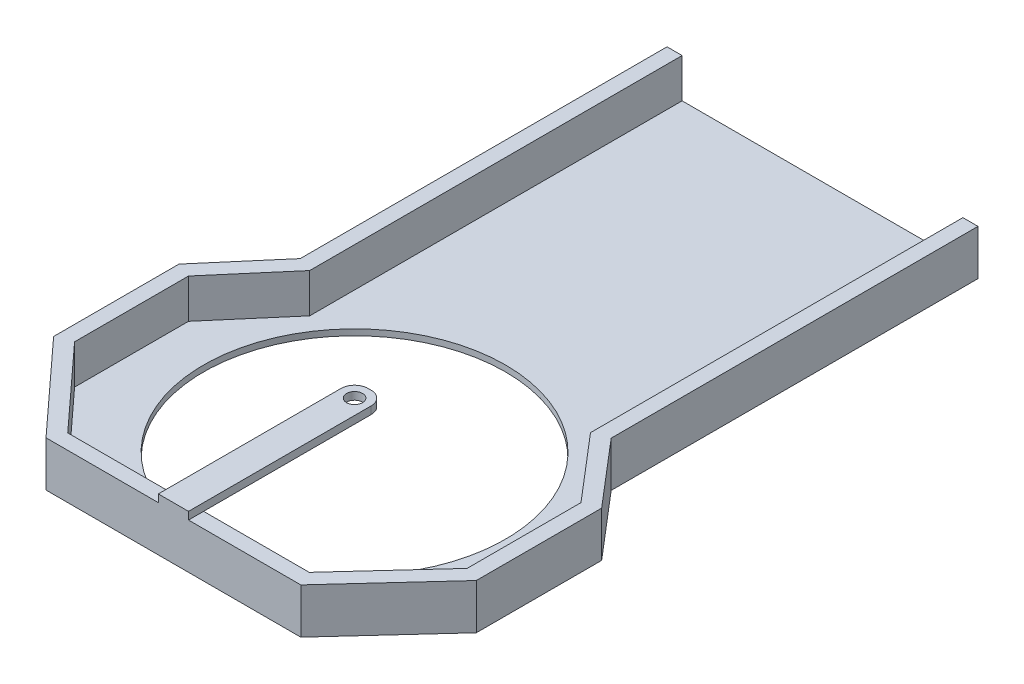
ISO-10303-21;
HEADER;
FILE_DESCRIPTION(('STEP AP214'),'2;1');
FILE_NAME('part.step','',(''),(''),'','','');
FILE_SCHEMA(('AUTOMOTIVE_DESIGN { 1 0 10303 214 1 1 1 1 }'));
ENDSEC;
DATA;
#1=APPLICATION_CONTEXT('core data for automotive mechanical design processes');
#2=APPLICATION_PROTOCOL_DEFINITION('international standard','automotive_design',2000,#1);
#3=PRODUCT_CONTEXT('',#1,'mechanical');
#4=PRODUCT('Part','Part','',(#3));
#5=PRODUCT_RELATED_PRODUCT_CATEGORY('part','',(#4));
#6=PRODUCT_DEFINITION_FORMATION('','',#4);
#7=PRODUCT_DEFINITION_CONTEXT('part definition',#1,'design');
#8=PRODUCT_DEFINITION('design','',#6,#7);
#9=PRODUCT_DEFINITION_SHAPE('','',#8);
#10=(LENGTH_UNIT() NAMED_UNIT(*) SI_UNIT(.MILLI.,.METRE.));
#11=(NAMED_UNIT(*) PLANE_ANGLE_UNIT() SI_UNIT($,.RADIAN.));
#12=(NAMED_UNIT(*) SI_UNIT($,.STERADIAN.) SOLID_ANGLE_UNIT());
#13=UNCERTAINTY_MEASURE_WITH_UNIT(LENGTH_MEASURE(1.E-05),#10,'distance_accuracy_value','');
#14=(GEOMETRIC_REPRESENTATION_CONTEXT(3) GLOBAL_UNCERTAINTY_ASSIGNED_CONTEXT((#13)) GLOBAL_UNIT_ASSIGNED_CONTEXT((#10,
#11,#12)) REPRESENTATION_CONTEXT('',''));
#15=CARTESIAN_POINT('',(0.,0.,0.));
#16=DIRECTION('',(0.,0.,1.));
#17=DIRECTION('',(1.,0.,0.));
#18=AXIS2_PLACEMENT_3D('',#15,#16,#17);
#19=CARTESIAN_POINT('',(0.,15.,0.));
#20=DIRECTION('',(0.,1.,0.));
#21=DIRECTION('',(0.,0.,1.));
#22=AXIS2_PLACEMENT_3D('',#19,#20,#21);
#23=PLANE('',#22);
#24=DIRECTION('',(1.,0.,0.));
#25=VECTOR('',#24,1.);
#26=CARTESIAN_POINT('',(-40.,15.,65.));
#27=LINE('',#26,#25);
#28=CARTESIAN_POINT('',(5.,15.,65.));
#29=VERTEX_POINT('',#28);
#30=CARTESIAN_POINT('',(40.,15.,65.));
#31=VERTEX_POINT('',#30);
#32=EDGE_CURVE('E114',#29,#31,#27,.T.);
#33=ORIENTED_EDGE('',*,*,#32,.F.);
#34=DIRECTION('',(0.,0.,1.));
#35=VECTOR('',#34,1.);
#36=CARTESIAN_POINT('',(5.,15.,9.50000000000001));
#37=LINE('',#36,#35);
#38=CARTESIAN_POINT('',(5.,15.,70.));
#39=VERTEX_POINT('',#38);
#40=EDGE_CURVE('E12',#29,#39,#37,.T.);
#41=ORIENTED_EDGE('',*,*,#40,.T.);
#42=DIRECTION('',(1.,0.,0.));
#43=VECTOR('',#42,1.);
#44=CARTESIAN_POINT('',(-40.,15.,70.));
#45=LINE('',#44,#43);
#46=CARTESIAN_POINT('',(42.1992175446281,15.,70.));
#47=VERTEX_POINT('',#46);
#48=EDGE_CURVE('E370',#39,#47,#45,.T.);
#49=ORIENTED_EDGE('',*,*,#48,.T.);
#50=DIRECTION('',(0.67579652856565,0.,-0.737088225369675));
#51=VECTOR('',#50,1.);
#52=CARTESIAN_POINT('',(43.6854411268484,15.,68.3789826428282));
#53=LINE('',#52,#51);
#54=CARTESIAN_POINT('',(70.,15.,39.6778119777988));
#55=VERTEX_POINT('',#54);
#56=EDGE_CURVE('E374',#47,#55,#53,.T.);
#57=ORIENTED_EDGE('',*,*,#56,.T.);
#58=DIRECTION('',(0.,0.,-1.));
#59=VECTOR('',#58,1.);
#60=CARTESIAN_POINT('',(70.,15.,0.));
#61=LINE('',#60,#59);
#62=CARTESIAN_POINT('',(70.,15.,-1.84503280254698));
#63=VERTEX_POINT('',#62);
#64=EDGE_CURVE('E376',#55,#63,#61,.T.);
#65=ORIENTED_EDGE('',*,*,#64,.T.);
#66=DIRECTION('',(-0.649564609260897,0.,-0.760306397708015));
#67=VECTOR('',#66,1.);
#68=CARTESIAN_POINT('',(68.8015319885401,15.,-3.24782304630455));
#69=LINE('',#68,#67);
#70=CARTESIAN_POINT('',(51.5,15.,-23.4990271197602));
#71=VERTEX_POINT('',#70);
#72=EDGE_CURVE('E378',#63,#71,#69,.T.);
#73=ORIENTED_EDGE('',*,*,#72,.T.);
#74=DIRECTION('',(0.,0.,-1.));
#75=VECTOR('',#74,1.);
#76=CARTESIAN_POINT('',(51.5,15.,-21.6539943172133));
#77=LINE('',#76,#75);
#78=CARTESIAN_POINT('',(51.5,15.,-145.));
#79=VERTEX_POINT('',#78);
#80=EDGE_CURVE('E380',#71,#79,#77,.T.);
#81=ORIENTED_EDGE('',*,*,#80,.T.);
#82=DIRECTION('',(-1.,0.,0.));
#83=VECTOR('',#82,1.);
#84=CARTESIAN_POINT('',(-46.5,15.,-145.));
#85=LINE('',#84,#83);
#86=CARTESIAN_POINT('',(46.5,15.,-145.));
#87=VERTEX_POINT('',#86);
#88=EDGE_CURVE('E383',#79,#87,#85,.T.);
#89=ORIENTED_EDGE('',*,*,#88,.T.);
#90=DIRECTION('',(0.,0.,-1.));
#91=VECTOR('',#90,1.);
#92=CARTESIAN_POINT('',(46.5,15.,-21.6539943172133));
#93=LINE('',#92,#91);
#94=CARTESIAN_POINT('',(46.5,15.,-21.6539943172133));
#95=VERTEX_POINT('',#94);
#96=EDGE_CURVE('E334',#95,#87,#93,.T.);
#97=ORIENTED_EDGE('',*,*,#96,.F.);
#98=DIRECTION('',(-0.649564609260897,0.,-0.760306397708015));
#99=VECTOR('',#98,1.);
#100=CARTESIAN_POINT('',(65.,15.,0.));
#101=LINE('',#100,#99);
#102=CARTESIAN_POINT('',(65.,15.,0.));
#103=VERTEX_POINT('',#102);
#104=EDGE_CURVE('E332',#103,#95,#101,.T.);
#105=ORIENTED_EDGE('',*,*,#104,.F.);
#106=DIRECTION('',(0.,0.,-1.));
#107=VECTOR('',#106,1.);
#108=CARTESIAN_POINT('',(65.,15.,0.));
#109=LINE('',#108,#107);
#110=CARTESIAN_POINT('',(65.,15.,37.7326127682946));
#111=VERTEX_POINT('',#110);
#112=EDGE_CURVE('E330',#111,#103,#109,.T.);
#113=ORIENTED_EDGE('',*,*,#112,.F.);
#114=DIRECTION('',(0.67579652856565,0.,-0.737088225369675));
#115=VECTOR('',#114,1.);
#116=CARTESIAN_POINT('',(40.,15.,65.));
#117=LINE('',#116,#115);
#118=EDGE_CURVE('E327',#31,#111,#117,.T.);
#119=ORIENTED_EDGE('',*,*,#118,.F.);
#120=EDGE_LOOP('',(#33,#41,#49,#57,#65,#73,#81,#89,#97,#105,#113,#119));
#121=FACE_BOUND('',#120,.T.);
#122=ADVANCED_FACE('F97',(#121),#23,.T.);
#123=CARTESIAN_POINT('',(0.,2.,0.));
#124=DIRECTION('',(0.,-1.,0.));
#125=DIRECTION('',(0.,0.,-1.));
#126=AXIS2_PLACEMENT_3D('',#123,#124,#125);
#127=PLANE('',#126);
#128=CARTESIAN_POINT('',(0.,2.,10.));
#129=DIRECTION('',(0.,1.,0.));
#130=DIRECTION('',(0.,0.,1.));
#131=AXIS2_PLACEMENT_3D('',#128,#129,#130);
#132=CIRCLE('',#131,50.);
#133=CARTESIAN_POINT('',(0.,2.,60.));
#134=VERTEX_POINT('',#133);
#135=EDGE_CURVE('E303',#134,#134,#132,.T.);
#136=ORIENTED_EDGE('',*,*,#135,.F.);
#137=EDGE_LOOP('',(#136));
#138=FACE_BOUND('',#137,.T.);
#139=DIRECTION('',(0.649564609260895,0.,-0.760306397708016));
#140=VECTOR('',#139,1.);
#141=CARTESIAN_POINT('',(-65.,2.,0.));
#142=LINE('',#141,#140);
#143=CARTESIAN_POINT('',(-65.,2.,0.));
#144=VERTEX_POINT('',#143);
#145=CARTESIAN_POINT('',(-46.5,2.,-21.6539943172133));
#146=VERTEX_POINT('',#145);
#147=EDGE_CURVE('E441',#144,#146,#142,.T.);
#148=ORIENTED_EDGE('',*,*,#147,.F.);
#149=DIRECTION('',(0.,0.,1.));
#150=VECTOR('',#149,1.);
#151=CARTESIAN_POINT('',(-65.,2.,0.));
#152=LINE('',#151,#150);
#153=CARTESIAN_POINT('',(-65.,2.,37.7326127682946));
#154=VERTEX_POINT('',#153);
#155=EDGE_CURVE('E101',#144,#154,#152,.T.);
#156=ORIENTED_EDGE('',*,*,#155,.T.);
#157=DIRECTION('',(0.675796528565651,0.,0.737088225369675));
#158=VECTOR('',#157,1.);
#159=CARTESIAN_POINT('',(-65.,2.,37.7326127682946));
#160=LINE('',#159,#158);
#161=CARTESIAN_POINT('',(-40.,2.,65.));
#162=VERTEX_POINT('',#161);
#163=EDGE_CURVE('E457',#154,#162,#160,.T.);
#164=ORIENTED_EDGE('',*,*,#163,.T.);
#165=DIRECTION('',(1.,0.,0.));
#166=VECTOR('',#165,1.);
#167=CARTESIAN_POINT('',(-40.,2.,65.));
#168=LINE('',#167,#166);
#169=CARTESIAN_POINT('',(40.,2.,65.));
#170=VERTEX_POINT('',#169);
#171=EDGE_CURVE('E455',#162,#170,#168,.T.);
#172=ORIENTED_EDGE('',*,*,#171,.T.);
#173=DIRECTION('',(0.67579652856565,0.,-0.737088225369675));
#174=VECTOR('',#173,1.);
#175=CARTESIAN_POINT('',(40.,2.,65.));
#176=LINE('',#175,#174);
#177=CARTESIAN_POINT('',(65.,2.,37.7326127682946));
#178=VERTEX_POINT('',#177);
#179=EDGE_CURVE('E452',#170,#178,#176,.T.);
#180=ORIENTED_EDGE('',*,*,#179,.T.);
#181=DIRECTION('',(0.,0.,1.));
#182=VECTOR('',#181,1.);
#183=CARTESIAN_POINT('',(65.,2.,0.));
#184=LINE('',#183,#182);
#185=CARTESIAN_POINT('',(65.,2.,0.));
#186=VERTEX_POINT('',#185);
#187=EDGE_CURVE('E450',#186,#178,#184,.T.);
#188=ORIENTED_EDGE('',*,*,#187,.F.);
#189=DIRECTION('',(-0.649564609260897,0.,-0.760306397708015));
#190=VECTOR('',#189,1.);
#191=CARTESIAN_POINT('',(65.,2.,0.));
#192=LINE('',#191,#190);
#193=CARTESIAN_POINT('',(46.5,2.,-21.6539943172133));
#194=VERTEX_POINT('',#193);
#195=EDGE_CURVE('E447',#186,#194,#192,.T.);
#196=ORIENTED_EDGE('',*,*,#195,.T.);
#197=DIRECTION('',(0.,0.,-1.));
#198=VECTOR('',#197,1.);
#199=CARTESIAN_POINT('',(46.5,2.,-21.6539943172133));
#200=LINE('',#199,#198);
#201=CARTESIAN_POINT('',(46.5,2.,-145.));
#202=VERTEX_POINT('',#201);
#203=EDGE_CURVE('E445',#194,#202,#200,.T.);
#204=ORIENTED_EDGE('',*,*,#203,.T.);
#205=DIRECTION('',(-1.,0.,0.));
#206=VECTOR('',#205,1.);
#207=CARTESIAN_POINT('',(-46.5,2.,-145.));
#208=LINE('',#207,#206);
#209=CARTESIAN_POINT('',(-46.5,2.,-145.));
#210=VERTEX_POINT('',#209);
#211=EDGE_CURVE('E320',#202,#210,#208,.T.);
#212=ORIENTED_EDGE('',*,*,#211,.T.);
#213=DIRECTION('',(0.,0.,-1.));
#214=VECTOR('',#213,1.);
#215=CARTESIAN_POINT('',(-46.5,2.,-21.6539943172133));
#216=LINE('',#215,#214);
#217=EDGE_CURVE('E443',#146,#210,#216,.T.);
#218=ORIENTED_EDGE('',*,*,#217,.F.);
#219=EDGE_LOOP('',(#148,#156,#164,#172,#180,#188,#196,#204,#212,#218));
#220=FACE_BOUND('',#219,.T.);
#221=ADVANCED_FACE('F505',(#138,#220),#127,.F.);
#222=CARTESIAN_POINT('',(-65.,15.,37.7326127682946));
#223=DIRECTION('',(0.737088225369674,0.,-0.67579652856565));
#224=DIRECTION('',(-0.675796528565651,0.,-0.737088225369675));
#225=AXIS2_PLACEMENT_3D('',#222,#223,#224);
#226=PLANE('',#225);
#227=ORIENTED_EDGE('',*,*,#163,.F.);
#228=DIRECTION('',(0.,-1.,0.));
#229=VECTOR('',#228,1.);
#230=CARTESIAN_POINT('',(-65.,15.,37.7326127682946));
#231=LINE('',#230,#229);
#232=CARTESIAN_POINT('',(-65.,15.,37.7326127682946));
#233=VERTEX_POINT('',#232);
#234=EDGE_CURVE('E343',#233,#154,#231,.T.);
#235=ORIENTED_EDGE('',*,*,#234,.F.);
#236=DIRECTION('',(0.675796528565651,0.,0.737088225369675));
#237=VECTOR('',#236,1.);
#238=CARTESIAN_POINT('',(-65.,15.,37.7326127682946));
#239=LINE('',#238,#237);
#240=CARTESIAN_POINT('',(-40.,15.,65.));
#241=VERTEX_POINT('',#240);
#242=EDGE_CURVE('E323',#233,#241,#239,.T.);
#243=ORIENTED_EDGE('',*,*,#242,.T.);
#244=DIRECTION('',(0.,-1.,0.));
#245=VECTOR('',#244,1.);
#246=CARTESIAN_POINT('',(-40.,15.,65.));
#247=LINE('',#246,#245);
#248=EDGE_CURVE('E363',#241,#162,#247,.T.);
#249=ORIENTED_EDGE('',*,*,#248,.T.);
#250=EDGE_LOOP('',(#227,#235,#243,#249));
#251=FACE_BOUND('',#250,.T.);
#252=ADVANCED_FACE('F511',(#251),#226,.T.);
#253=CARTESIAN_POINT('',(-40.,15.,65.));
#254=DIRECTION('',(0.,0.,-1.));
#255=DIRECTION('',(-1.,0.,0.));
#256=AXIS2_PLACEMENT_3D('',#253,#254,#255);
#257=PLANE('',#256);
#258=ORIENTED_EDGE('',*,*,#171,.F.);
#259=ORIENTED_EDGE('',*,*,#248,.F.);
#260=CARTESIAN_POINT('',(-5.,15.,65.));
#261=VERTEX_POINT('',#260);
#262=EDGE_CURVE('E325',#241,#261,#27,.T.);
#263=ORIENTED_EDGE('',*,*,#262,.T.);
#264=EDGE_CURVE('E328',#261,#29,#27,.T.);
#265=ORIENTED_EDGE('',*,*,#264,.T.);
#266=ORIENTED_EDGE('',*,*,#32,.T.);
#267=DIRECTION('',(0.,-1.,0.));
#268=VECTOR('',#267,1.);
#269=CARTESIAN_POINT('',(40.,15.,65.));
#270=LINE('',#269,#268);
#271=EDGE_CURVE('E360',#31,#170,#270,.T.);
#272=ORIENTED_EDGE('',*,*,#271,.T.);
#273=EDGE_LOOP('',(#258,#259,#263,#265,#266,#272));
#274=FACE_BOUND('',#273,.T.);
#275=ADVANCED_FACE('F556',(#274),#257,.T.);
#276=CARTESIAN_POINT('',(40.,15.,65.));
#277=DIRECTION('',(-0.737088225369675,0.,-0.67579652856565));
#278=DIRECTION('',(-0.67579652856565,0.,0.737088225369675));
#279=AXIS2_PLACEMENT_3D('',#276,#277,#278);
#280=PLANE('',#279);
#281=ORIENTED_EDGE('',*,*,#179,.F.);
#282=ORIENTED_EDGE('',*,*,#271,.F.);
#283=ORIENTED_EDGE('',*,*,#118,.T.);
#284=DIRECTION('',(0.,-1.,0.));
#285=VECTOR('',#284,1.);
#286=CARTESIAN_POINT('',(65.,15.,37.7326127682946));
#287=LINE('',#286,#285);
#288=EDGE_CURVE('E357',#111,#178,#287,.T.);
#289=ORIENTED_EDGE('',*,*,#288,.T.);
#290=EDGE_LOOP('',(#281,#282,#283,#289));
#291=FACE_BOUND('',#290,.T.);
#292=ADVANCED_FACE('F552',(#291),#280,.T.);
#293=CARTESIAN_POINT('',(65.,15.,0.));
#294=DIRECTION('',(-1.,0.,0.));
#295=DIRECTION('',(0.,0.,1.));
#296=AXIS2_PLACEMENT_3D('',#293,#294,#295);
#297=PLANE('',#296);
#298=ORIENTED_EDGE('',*,*,#187,.T.);
#299=ORIENTED_EDGE('',*,*,#288,.F.);
#300=ORIENTED_EDGE('',*,*,#112,.T.);
#301=DIRECTION('',(0.,-1.,0.));
#302=VECTOR('',#301,1.);
#303=CARTESIAN_POINT('',(65.,15.,0.));
#304=LINE('',#303,#302);
#305=EDGE_CURVE('E354',#103,#186,#304,.T.);
#306=ORIENTED_EDGE('',*,*,#305,.T.);
#307=EDGE_LOOP('',(#298,#299,#300,#306));
#308=FACE_BOUND('',#307,.T.);
#309=ADVANCED_FACE('F548',(#308),#297,.T.);
#310=CARTESIAN_POINT('',(65.,15.,0.));
#311=DIRECTION('',(-0.760306397708015,0.,0.649564609260897));
#312=DIRECTION('',(0.649564609260897,0.,0.760306397708015));
#313=AXIS2_PLACEMENT_3D('',#310,#311,#312);
#314=PLANE('',#313);
#315=ORIENTED_EDGE('',*,*,#195,.F.);
#316=ORIENTED_EDGE('',*,*,#305,.F.);
#317=ORIENTED_EDGE('',*,*,#104,.T.);
#318=DIRECTION('',(0.,-1.,0.));
#319=VECTOR('',#318,1.);
#320=CARTESIAN_POINT('',(46.5,15.,-21.6539943172133));
#321=LINE('',#320,#319);
#322=EDGE_CURVE('E351',#95,#194,#321,.T.);
#323=ORIENTED_EDGE('',*,*,#322,.T.);
#324=EDGE_LOOP('',(#315,#316,#317,#323));
#325=FACE_BOUND('',#324,.T.);
#326=ADVANCED_FACE('F544',(#325),#314,.T.);
#327=CARTESIAN_POINT('',(46.5,15.,-21.6539943172133));
#328=DIRECTION('',(-1.,0.,0.));
#329=DIRECTION('',(0.,0.,1.));
#330=AXIS2_PLACEMENT_3D('',#327,#328,#329);
#331=PLANE('',#330);
#332=ORIENTED_EDGE('',*,*,#203,.F.);
#333=ORIENTED_EDGE('',*,*,#322,.F.);
#334=ORIENTED_EDGE('',*,*,#96,.T.);
#335=DIRECTION('',(0.,-1.,0.));
#336=VECTOR('',#335,1.);
#337=CARTESIAN_POINT('',(46.5,15.,-145.));
#338=LINE('',#337,#336);
#339=EDGE_CURVE('E314',#87,#202,#338,.T.);
#340=ORIENTED_EDGE('',*,*,#339,.T.);
#341=EDGE_LOOP('',(#332,#333,#334,#340));
#342=FACE_BOUND('',#341,.T.);
#343=ADVANCED_FACE('F540',(#342),#331,.T.);
#344=CARTESIAN_POINT('',(-46.5,15.,-21.6539943172133));
#345=DIRECTION('',(1.,0.,0.));
#346=DIRECTION('',(0.,0.,-1.));
#347=AXIS2_PLACEMENT_3D('',#344,#345,#346);
#348=PLANE('',#347);
#349=ORIENTED_EDGE('',*,*,#217,.T.);
#350=DIRECTION('',(0.,1.,0.));
#351=VECTOR('',#350,1.);
#352=CARTESIAN_POINT('',(-46.5,15.,-145.));
#353=LINE('',#352,#351);
#354=CARTESIAN_POINT('',(-46.5,15.,-145.));
#355=VERTEX_POINT('',#354);
#356=EDGE_CURVE('E317',#210,#355,#353,.T.);
#357=ORIENTED_EDGE('',*,*,#356,.T.);
#358=DIRECTION('',(0.,0.,1.));
#359=VECTOR('',#358,1.);
#360=CARTESIAN_POINT('',(-46.5,15.,-21.6539943172133));
#361=LINE('',#360,#359);
#362=CARTESIAN_POINT('',(-46.5,15.,-21.6539943172133));
#363=VERTEX_POINT('',#362);
#364=EDGE_CURVE('E336',#355,#363,#361,.T.);
#365=ORIENTED_EDGE('',*,*,#364,.T.);
#366=DIRECTION('',(0.,-1.,0.));
#367=VECTOR('',#366,1.);
#368=CARTESIAN_POINT('',(-46.5,15.,-21.6539943172133));
#369=LINE('',#368,#367);
#370=EDGE_CURVE('E348',#363,#146,#369,.T.);
#371=ORIENTED_EDGE('',*,*,#370,.T.);
#372=EDGE_LOOP('',(#349,#357,#365,#371));
#373=FACE_BOUND('',#372,.T.);
#374=ADVANCED_FACE('F531',(#373),#348,.T.);
#375=CARTESIAN_POINT('',(-65.,15.,0.));
#376=DIRECTION('',(0.760306397708016,0.,0.649564609260895));
#377=DIRECTION('',(0.649564609260895,0.,-0.760306397708016));
#378=AXIS2_PLACEMENT_3D('',#375,#376,#377);
#379=PLANE('',#378);
#380=ORIENTED_EDGE('',*,*,#147,.T.);
#381=ORIENTED_EDGE('',*,*,#370,.F.);
#382=DIRECTION('',(-0.649564609260895,0.,0.760306397708016));
#383=VECTOR('',#382,1.);
#384=CARTESIAN_POINT('',(-65.,15.,0.));
#385=LINE('',#384,#383);
#386=CARTESIAN_POINT('',(-65.,15.,0.));
#387=VERTEX_POINT('',#386);
#388=EDGE_CURVE('E338',#363,#387,#385,.T.);
#389=ORIENTED_EDGE('',*,*,#388,.T.);
#390=DIRECTION('',(0.,-1.,0.));
#391=VECTOR('',#390,1.);
#392=CARTESIAN_POINT('',(-65.,15.,0.));
#393=LINE('',#392,#391);
#394=EDGE_CURVE('E345',#387,#144,#393,.T.);
#395=ORIENTED_EDGE('',*,*,#394,.T.);
#396=EDGE_LOOP('',(#380,#381,#389,#395));
#397=FACE_BOUND('',#396,.T.);
#398=ADVANCED_FACE('F525',(#397),#379,.T.);
#399=CARTESIAN_POINT('',(-65.,15.,0.));
#400=DIRECTION('',(1.,0.,0.));
#401=DIRECTION('',(0.,0.,-1.));
#402=AXIS2_PLACEMENT_3D('',#399,#400,#401);
#403=PLANE('',#402);
#404=ORIENTED_EDGE('',*,*,#155,.F.);
#405=ORIENTED_EDGE('',*,*,#394,.F.);
#406=DIRECTION('',(0.,0.,1.));
#407=VECTOR('',#406,1.);
#408=CARTESIAN_POINT('',(-65.,15.,0.));
#409=LINE('',#408,#407);
#410=EDGE_CURVE('E341',#387,#233,#409,.T.);
#411=ORIENTED_EDGE('',*,*,#410,.T.);
#412=ORIENTED_EDGE('',*,*,#234,.T.);
#413=EDGE_LOOP('',(#404,#405,#411,#412));
#414=FACE_BOUND('',#413,.T.);
#415=ADVANCED_FACE('F517',(#414),#403,.T.);
#416=DIRECTION('',(0.,0.,1.));
#417=VECTOR('',#416,1.);
#418=CARTESIAN_POINT('',(-5.,15.,9.50000000000001));
#419=LINE('',#418,#417);
#420=CARTESIAN_POINT('',(-4.99999999999999,15.,70.));
#421=VERTEX_POINT('',#420);
#422=EDGE_CURVE('E106',#261,#421,#419,.T.);
#423=ORIENTED_EDGE('',*,*,#422,.F.);
#424=ORIENTED_EDGE('',*,*,#262,.F.);
#425=ORIENTED_EDGE('',*,*,#242,.F.);
#426=ORIENTED_EDGE('',*,*,#410,.F.);
#427=ORIENTED_EDGE('',*,*,#388,.F.);
#428=ORIENTED_EDGE('',*,*,#364,.F.);
#429=CARTESIAN_POINT('',(-51.5,15.,-145.));
#430=VERTEX_POINT('',#429);
#431=EDGE_CURVE('E382',#355,#430,#85,.T.);
#432=ORIENTED_EDGE('',*,*,#431,.T.);
#433=DIRECTION('',(0.,0.,1.));
#434=VECTOR('',#433,1.);
#435=CARTESIAN_POINT('',(-51.5,15.,-21.6539943172133));
#436=LINE('',#435,#434);
#437=CARTESIAN_POINT('',(-51.5,15.,-23.4990271197602));
#438=VERTEX_POINT('',#437);
#439=EDGE_CURVE('E386',#430,#438,#436,.T.);
#440=ORIENTED_EDGE('',*,*,#439,.T.);
#441=DIRECTION('',(-0.649564609260895,0.,0.760306397708016));
#442=VECTOR('',#441,1.);
#443=CARTESIAN_POINT('',(-68.8015319885401,15.,-3.24782304630445));
#444=LINE('',#443,#442);
#445=CARTESIAN_POINT('',(-70.,15.,-1.84503280254688));
#446=VERTEX_POINT('',#445);
#447=EDGE_CURVE('E388',#438,#446,#444,.T.);
#448=ORIENTED_EDGE('',*,*,#447,.T.);
#449=DIRECTION('',(0.,0.,1.));
#450=VECTOR('',#449,1.);
#451=CARTESIAN_POINT('',(-70.,15.,0.));
#452=LINE('',#451,#450);
#453=CARTESIAN_POINT('',(-70.,15.,39.6778119777988));
#454=VERTEX_POINT('',#453);
#455=EDGE_CURVE('E390',#446,#454,#452,.T.);
#456=ORIENTED_EDGE('',*,*,#455,.T.);
#457=DIRECTION('',(0.67579652856565,0.,0.737088225369674));
#458=VECTOR('',#457,1.);
#459=CARTESIAN_POINT('',(-68.6854411268484,15.,41.1115954111228));
#460=LINE('',#459,#458);
#461=CARTESIAN_POINT('',(-42.1992175446281,15.,70.));
#462=VERTEX_POINT('',#461);
#463=EDGE_CURVE('E367',#454,#462,#460,.T.);
#464=ORIENTED_EDGE('',*,*,#463,.T.);
#465=EDGE_CURVE('E372',#462,#421,#45,.T.);
#466=ORIENTED_EDGE('',*,*,#465,.T.);
#467=EDGE_LOOP('',(#423,#424,#425,#426,#427,#428,#432,#440,#448,#456,#464,#466));
#468=FACE_BOUND('',#467,.T.);
#469=ADVANCED_FACE('F507',(#468),#23,.T.);
#470=CARTESIAN_POINT('',(-68.6854411268484,15.,41.1115954111228));
#471=DIRECTION('',(0.737088225369674,0.,-0.67579652856565));
#472=DIRECTION('',(-0.675796528565651,0.,-0.737088225369675));
#473=AXIS2_PLACEMENT_3D('',#470,#471,#472);
#474=PLANE('',#473);
#475=DIRECTION('',(0.67579652856565,0.,0.737088225369674));
#476=VECTOR('',#475,1.);
#477=CARTESIAN_POINT('',(-68.6854411268484,0.,41.1115954111228));
#478=LINE('',#477,#476);
#479=CARTESIAN_POINT('',(-70.,0.,39.6778119777988));
#480=VERTEX_POINT('',#479);
#481=CARTESIAN_POINT('',(-42.1992175446281,0.,70.));
#482=VERTEX_POINT('',#481);
#483=EDGE_CURVE('E366',#480,#482,#478,.T.);
#484=ORIENTED_EDGE('',*,*,#483,.T.);
#485=DIRECTION('',(0.,-1.,0.));
#486=VECTOR('',#485,1.);
#487=CARTESIAN_POINT('',(-42.1992175446281,15.,70.));
#488=LINE('',#487,#486);
#489=EDGE_CURVE('E438',#462,#482,#488,.T.);
#490=ORIENTED_EDGE('',*,*,#489,.F.);
#491=ORIENTED_EDGE('',*,*,#463,.F.);
#492=DIRECTION('',(0.,-1.,0.));
#493=VECTOR('',#492,1.);
#494=CARTESIAN_POINT('',(-70.,15.,39.6778119777988));
#495=LINE('',#494,#493);
#496=EDGE_CURVE('E392',#454,#480,#495,.T.);
#497=ORIENTED_EDGE('',*,*,#496,.T.);
#498=EDGE_LOOP('',(#484,#490,#491,#497));
#499=FACE_BOUND('',#498,.T.);
#500=ADVANCED_FACE('F516',(#499),#474,.F.);
#501=CARTESIAN_POINT('',(-40.,15.,70.));
#502=DIRECTION('',(0.,0.,-1.));
#503=DIRECTION('',(-1.,0.,0.));
#504=AXIS2_PLACEMENT_3D('',#501,#502,#503);
#505=PLANE('',#504);
#506=DIRECTION('',(1.,0.,0.));
#507=VECTOR('',#506,1.);
#508=CARTESIAN_POINT('',(-40.,0.,70.));
#509=LINE('',#508,#507);
#510=CARTESIAN_POINT('',(42.1992175446281,0.,70.));
#511=VERTEX_POINT('',#510);
#512=EDGE_CURVE('E395',#482,#511,#509,.T.);
#513=ORIENTED_EDGE('',*,*,#512,.T.);
#514=DIRECTION('',(0.,-1.,0.));
#515=VECTOR('',#514,1.);
#516=CARTESIAN_POINT('',(42.1992175446281,15.,70.));
#517=LINE('',#516,#515);
#518=EDGE_CURVE('E435',#47,#511,#517,.T.);
#519=ORIENTED_EDGE('',*,*,#518,.F.);
#520=ORIENTED_EDGE('',*,*,#48,.F.);
#521=DIRECTION('',(0.,-1.,0.));
#522=VECTOR('',#521,1.);
#523=CARTESIAN_POINT('',(5.00000000000001,17.5,70.));
#524=LINE('',#523,#522);
#525=CARTESIAN_POINT('',(5.00000000000001,17.5,70.));
#526=VERTEX_POINT('',#525);
#527=EDGE_CURVE('E308',#526,#39,#524,.T.);
#528=ORIENTED_EDGE('',*,*,#527,.F.);
#529=DIRECTION('',(1.,0.,0.));
#530=VECTOR('',#529,1.);
#531=CARTESIAN_POINT('',(-4.99999999999999,17.5,70.));
#532=LINE('',#531,#530);
#533=CARTESIAN_POINT('',(-4.99999999999999,17.5,70.));
#534=VERTEX_POINT('',#533);
#535=EDGE_CURVE('E289',#534,#526,#532,.T.);
#536=ORIENTED_EDGE('',*,*,#535,.F.);
#537=DIRECTION('',(0.,-1.,0.));
#538=VECTOR('',#537,1.);
#539=CARTESIAN_POINT('',(-4.99999999999999,17.5,70.));
#540=LINE('',#539,#538);
#541=EDGE_CURVE('E286',#534,#421,#540,.T.);
#542=ORIENTED_EDGE('',*,*,#541,.T.);
#543=ORIENTED_EDGE('',*,*,#465,.F.);
#544=ORIENTED_EDGE('',*,*,#489,.T.);
#545=EDGE_LOOP('',(#513,#519,#520,#528,#536,#542,#543,#544));
#546=FACE_BOUND('',#545,.T.);
#547=ADVANCED_FACE('F522',(#546),#505,.F.);
#548=CARTESIAN_POINT('',(43.6854411268484,15.,68.3789826428282));
#549=DIRECTION('',(-0.737088225369675,0.,-0.67579652856565));
#550=DIRECTION('',(-0.67579652856565,0.,0.737088225369675));
#551=AXIS2_PLACEMENT_3D('',#548,#549,#550);
#552=PLANE('',#551);
#553=DIRECTION('',(0.67579652856565,0.,-0.737088225369675));
#554=VECTOR('',#553,1.);
#555=CARTESIAN_POINT('',(43.6854411268484,0.,68.3789826428282));
#556=LINE('',#555,#554);
#557=CARTESIAN_POINT('',(70.,0.,39.6778119777988));
#558=VERTEX_POINT('',#557);
#559=EDGE_CURVE('E397',#511,#558,#556,.T.);
#560=ORIENTED_EDGE('',*,*,#559,.T.);
#561=DIRECTION('',(0.,-1.,0.));
#562=VECTOR('',#561,1.);
#563=CARTESIAN_POINT('',(70.,15.,39.6778119777988));
#564=LINE('',#563,#562);
#565=EDGE_CURVE('E432',#55,#558,#564,.T.);
#566=ORIENTED_EDGE('',*,*,#565,.F.);
#567=ORIENTED_EDGE('',*,*,#56,.F.);
#568=ORIENTED_EDGE('',*,*,#518,.T.);
#569=EDGE_LOOP('',(#560,#566,#567,#568));
#570=FACE_BOUND('',#569,.T.);
#571=ADVANCED_FACE('F641',(#570),#552,.F.);
#572=CARTESIAN_POINT('',(70.,15.,0.));
#573=DIRECTION('',(-1.,0.,0.));
#574=DIRECTION('',(0.,0.,1.));
#575=AXIS2_PLACEMENT_3D('',#572,#573,#574);
#576=PLANE('',#575);
#577=DIRECTION('',(0.,0.,-1.));
#578=VECTOR('',#577,1.);
#579=CARTESIAN_POINT('',(70.,0.,0.));
#580=LINE('',#579,#578);
#581=CARTESIAN_POINT('',(70.,0.,-1.84503280254698));
#582=VERTEX_POINT('',#581);
#583=EDGE_CURVE('E399',#558,#582,#580,.T.);
#584=ORIENTED_EDGE('',*,*,#583,.T.);
#585=DIRECTION('',(0.,-1.,0.));
#586=VECTOR('',#585,1.);
#587=CARTESIAN_POINT('',(70.,15.,-1.84503280254698));
#588=LINE('',#587,#586);
#589=EDGE_CURVE('E429',#63,#582,#588,.T.);
#590=ORIENTED_EDGE('',*,*,#589,.F.);
#591=ORIENTED_EDGE('',*,*,#64,.F.);
#592=ORIENTED_EDGE('',*,*,#565,.T.);
#593=EDGE_LOOP('',(#584,#590,#591,#592));
#594=FACE_BOUND('',#593,.T.);
#595=ADVANCED_FACE('F645',(#594),#576,.F.);
#596=CARTESIAN_POINT('',(68.8015319885401,15.,-3.24782304630455));
#597=DIRECTION('',(-0.760306397708015,0.,0.649564609260897));
#598=DIRECTION('',(0.649564609260897,0.,0.760306397708015));
#599=AXIS2_PLACEMENT_3D('',#596,#597,#598);
#600=PLANE('',#599);
#601=DIRECTION('',(-0.649564609260897,0.,-0.760306397708015));
#602=VECTOR('',#601,1.);
#603=CARTESIAN_POINT('',(68.8015319885401,0.,-3.24782304630455));
#604=LINE('',#603,#602);
#605=CARTESIAN_POINT('',(51.5,0.,-23.4990271197602));
#606=VERTEX_POINT('',#605);
#607=EDGE_CURVE('E401',#582,#606,#604,.T.);
#608=ORIENTED_EDGE('',*,*,#607,.T.);
#609=DIRECTION('',(0.,-1.,0.));
#610=VECTOR('',#609,1.);
#611=CARTESIAN_POINT('',(51.5,15.,-23.4990271197602));
#612=LINE('',#611,#610);
#613=EDGE_CURVE('E426',#71,#606,#612,.T.);
#614=ORIENTED_EDGE('',*,*,#613,.F.);
#615=ORIENTED_EDGE('',*,*,#72,.F.);
#616=ORIENTED_EDGE('',*,*,#589,.T.);
#617=EDGE_LOOP('',(#608,#614,#615,#616));
#618=FACE_BOUND('',#617,.T.);
#619=ADVANCED_FACE('F650',(#618),#600,.F.);
#620=CARTESIAN_POINT('',(51.5,15.,-21.6539943172133));
#621=DIRECTION('',(-1.,0.,0.));
#622=DIRECTION('',(0.,0.,1.));
#623=AXIS2_PLACEMENT_3D('',#620,#621,#622);
#624=PLANE('',#623);
#625=DIRECTION('',(0.,0.,-1.));
#626=VECTOR('',#625,1.);
#627=CARTESIAN_POINT('',(51.5,0.,-21.6539943172133));
#628=LINE('',#627,#626);
#629=CARTESIAN_POINT('',(51.5,0.,-145.));
#630=VERTEX_POINT('',#629);
#631=EDGE_CURVE('E403',#606,#630,#628,.T.);
#632=ORIENTED_EDGE('',*,*,#631,.T.);
#633=DIRECTION('',(0.,-1.,0.));
#634=VECTOR('',#633,1.);
#635=CARTESIAN_POINT('',(51.5,15.,-145.));
#636=LINE('',#635,#634);
#637=EDGE_CURVE('E423',#79,#630,#636,.T.);
#638=ORIENTED_EDGE('',*,*,#637,.F.);
#639=ORIENTED_EDGE('',*,*,#80,.F.);
#640=ORIENTED_EDGE('',*,*,#613,.T.);
#641=EDGE_LOOP('',(#632,#638,#639,#640));
#642=FACE_BOUND('',#641,.T.);
#643=ADVANCED_FACE('F651',(#642),#624,.F.);
#644=CARTESIAN_POINT('',(-46.5,15.,-145.));
#645=DIRECTION('',(0.,0.,1.));
#646=DIRECTION('',(1.,0.,0.));
#647=AXIS2_PLACEMENT_3D('',#644,#645,#646);
#648=PLANE('',#647);
#649=ORIENTED_EDGE('',*,*,#431,.F.);
#650=ORIENTED_EDGE('',*,*,#356,.F.);
#651=ORIENTED_EDGE('',*,*,#211,.F.);
#652=ORIENTED_EDGE('',*,*,#339,.F.);
#653=ORIENTED_EDGE('',*,*,#88,.F.);
#654=ORIENTED_EDGE('',*,*,#637,.T.);
#655=DIRECTION('',(-1.,0.,0.));
#656=VECTOR('',#655,1.);
#657=CARTESIAN_POINT('',(-46.5,0.,-145.));
#658=LINE('',#657,#656);
#659=CARTESIAN_POINT('',(-51.5,0.,-145.));
#660=VERTEX_POINT('',#659);
#661=EDGE_CURVE('E405',#630,#660,#658,.T.);
#662=ORIENTED_EDGE('',*,*,#661,.T.);
#663=DIRECTION('',(0.,-1.,0.));
#664=VECTOR('',#663,1.);
#665=CARTESIAN_POINT('',(-51.5,15.,-145.));
#666=LINE('',#665,#664);
#667=EDGE_CURVE('E420',#430,#660,#666,.T.);
#668=ORIENTED_EDGE('',*,*,#667,.F.);
#669=EDGE_LOOP('',(#649,#650,#651,#652,#653,#654,#662,#668));
#670=FACE_BOUND('',#669,.T.);
#671=ADVANCED_FACE('F577',(#670),#648,.F.);
#672=CARTESIAN_POINT('',(-51.5,15.,-21.6539943172133));
#673=DIRECTION('',(1.,0.,0.));
#674=DIRECTION('',(0.,0.,-1.));
#675=AXIS2_PLACEMENT_3D('',#672,#673,#674);
#676=PLANE('',#675);
#677=DIRECTION('',(0.,0.,1.));
#678=VECTOR('',#677,1.);
#679=CARTESIAN_POINT('',(-51.5,0.,-21.6539943172133));
#680=LINE('',#679,#678);
#681=CARTESIAN_POINT('',(-51.5,0.,-23.4990271197602));
#682=VERTEX_POINT('',#681);
#683=EDGE_CURVE('E407',#660,#682,#680,.T.);
#684=ORIENTED_EDGE('',*,*,#683,.T.);
#685=DIRECTION('',(0.,-1.,0.));
#686=VECTOR('',#685,1.);
#687=CARTESIAN_POINT('',(-51.5,15.,-23.4990271197602));
#688=LINE('',#687,#686);
#689=EDGE_CURVE('E417',#438,#682,#688,.T.);
#690=ORIENTED_EDGE('',*,*,#689,.F.);
#691=ORIENTED_EDGE('',*,*,#439,.F.);
#692=ORIENTED_EDGE('',*,*,#667,.T.);
#693=EDGE_LOOP('',(#684,#690,#691,#692));
#694=FACE_BOUND('',#693,.T.);
#695=ADVANCED_FACE('F584',(#694),#676,.F.);
#696=CARTESIAN_POINT('',(-68.8015319885401,15.,-3.24782304630445));
#697=DIRECTION('',(0.760306397708016,0.,0.649564609260895));
#698=DIRECTION('',(0.649564609260895,0.,-0.760306397708017));
#699=AXIS2_PLACEMENT_3D('',#696,#697,#698);
#700=PLANE('',#699);
#701=DIRECTION('',(-0.649564609260895,0.,0.760306397708016));
#702=VECTOR('',#701,1.);
#703=CARTESIAN_POINT('',(-68.8015319885401,0.,-3.24782304630445));
#704=LINE('',#703,#702);
#705=CARTESIAN_POINT('',(-70.,0.,-1.84503280254688));
#706=VERTEX_POINT('',#705);
#707=EDGE_CURVE('E409',#682,#706,#704,.T.);
#708=ORIENTED_EDGE('',*,*,#707,.T.);
#709=DIRECTION('',(0.,-1.,0.));
#710=VECTOR('',#709,1.);
#711=CARTESIAN_POINT('',(-70.,15.,-1.84503280254688));
#712=LINE('',#711,#710);
#713=EDGE_CURVE('E414',#446,#706,#712,.T.);
#714=ORIENTED_EDGE('',*,*,#713,.F.);
#715=ORIENTED_EDGE('',*,*,#447,.F.);
#716=ORIENTED_EDGE('',*,*,#689,.T.);
#717=EDGE_LOOP('',(#708,#714,#715,#716));
#718=FACE_BOUND('',#717,.T.);
#719=ADVANCED_FACE('F588',(#718),#700,.F.);
#720=CARTESIAN_POINT('',(-70.,15.,0.));
#721=DIRECTION('',(1.,0.,0.));
#722=DIRECTION('',(0.,0.,-1.));
#723=AXIS2_PLACEMENT_3D('',#720,#721,#722);
#724=PLANE('',#723);
#725=DIRECTION('',(0.,0.,1.));
#726=VECTOR('',#725,1.);
#727=CARTESIAN_POINT('',(-70.,0.,0.));
#728=LINE('',#727,#726);
#729=EDGE_CURVE('E371',#706,#480,#728,.T.);
#730=ORIENTED_EDGE('',*,*,#729,.T.);
#731=ORIENTED_EDGE('',*,*,#496,.F.);
#732=ORIENTED_EDGE('',*,*,#455,.F.);
#733=ORIENTED_EDGE('',*,*,#713,.T.);
#734=EDGE_LOOP('',(#730,#731,#732,#733));
#735=FACE_BOUND('',#734,.T.);
#736=ADVANCED_FACE('F593',(#735),#724,.F.);
#737=CARTESIAN_POINT('',(0.,0.,0.));
#738=DIRECTION('',(0.,-1.,0.));
#739=DIRECTION('',(0.,0.,-1.));
#740=AXIS2_PLACEMENT_3D('',#737,#738,#739);
#741=PLANE('',#740);
#742=CARTESIAN_POINT('',(0.,0.,10.));
#743=DIRECTION('',(0.,-1.,0.));
#744=DIRECTION('',(0.,0.,-1.));
#745=AXIS2_PLACEMENT_3D('',#742,#743,#744);
#746=CIRCLE('',#745,50.);
#747=CARTESIAN_POINT('',(0.,0.,-40.));
#748=VERTEX_POINT('',#747);
#749=EDGE_CURVE('E306',#748,#748,#746,.F.);
#750=ORIENTED_EDGE('',*,*,#749,.T.);
#751=EDGE_LOOP('',(#750));
#752=FACE_BOUND('',#751,.T.);
#753=ORIENTED_EDGE('',*,*,#483,.F.);
#754=ORIENTED_EDGE('',*,*,#729,.F.);
#755=ORIENTED_EDGE('',*,*,#707,.F.);
#756=ORIENTED_EDGE('',*,*,#683,.F.);
#757=ORIENTED_EDGE('',*,*,#661,.F.);
#758=ORIENTED_EDGE('',*,*,#631,.F.);
#759=ORIENTED_EDGE('',*,*,#607,.F.);
#760=ORIENTED_EDGE('',*,*,#583,.F.);
#761=ORIENTED_EDGE('',*,*,#559,.F.);
#762=ORIENTED_EDGE('',*,*,#512,.F.);
#763=EDGE_LOOP('',(#753,#754,#755,#756,#757,#758,#759,#760,#761,#762));
#764=FACE_BOUND('',#763,.T.);
#765=ADVANCED_FACE('F99',(#752,#764),#741,.T.);
#766=CARTESIAN_POINT('',(0.,-141.42135623731,10.));
#767=DIRECTION('',(0.,1.,0.));
#768=DIRECTION('',(0.,0.,1.));
#769=AXIS2_PLACEMENT_3D('',#766,#767,#768);
#770=CYLINDRICAL_SURFACE('',#769,50.);
#771=ORIENTED_EDGE('',*,*,#135,.T.);
#772=EDGE_LOOP('',(#771));
#773=FACE_BOUND('',#772,.T.);
#774=ORIENTED_EDGE('',*,*,#749,.F.);
#775=EDGE_LOOP('',(#774));
#776=FACE_BOUND('',#775,.T.);
#777=ADVANCED_FACE('F535',(#773,#776),#770,.F.);
#778=CARTESIAN_POINT('',(-0.500000000000002,17.5,9.50000000000001));
#779=DIRECTION('',(0.,-1.,0.));
#780=DIRECTION('',(0.,0.,-1.));
#781=AXIS2_PLACEMENT_3D('',#778,#779,#780);
#782=CYLINDRICAL_SURFACE('',#781,4.5);
#783=CARTESIAN_POINT('',(-0.500000000000002,15.,9.50000000000001));
#784=DIRECTION('',(0.,1.,0.));
#785=DIRECTION('',(0.,0.,1.));
#786=AXIS2_PLACEMENT_3D('',#783,#784,#785);
#787=CIRCLE('',#786,4.5);
#788=CARTESIAN_POINT('',(-0.500000000000002,15.,5.00000000000001));
#789=VERTEX_POINT('',#788);
#790=CARTESIAN_POINT('',(-5.,15.,9.50000000000001));
#791=VERTEX_POINT('',#790);
#792=EDGE_CURVE('E302',#789,#791,#787,.T.);
#793=ORIENTED_EDGE('',*,*,#792,.T.);
#794=DIRECTION('',(0.,-1.,0.));
#795=VECTOR('',#794,1.);
#796=CARTESIAN_POINT('',(-5.,17.5,9.50000000000001));
#797=LINE('',#796,#795);
#798=CARTESIAN_POINT('',(-5.,17.5,9.50000000000001));
#799=VERTEX_POINT('',#798);
#800=EDGE_CURVE('E283',#799,#791,#797,.T.);
#801=ORIENTED_EDGE('',*,*,#800,.F.);
#802=CARTESIAN_POINT('',(-0.500000000000002,17.5,9.50000000000001));
#803=DIRECTION('',(0.,1.,0.));
#804=DIRECTION('',(0.,0.,1.));
#805=AXIS2_PLACEMENT_3D('',#802,#803,#804);
#806=CIRCLE('',#805,4.5);
#807=CARTESIAN_POINT('',(-0.500000000000002,17.5,5.00000000000001));
#808=VERTEX_POINT('',#807);
#809=EDGE_CURVE('E290',#808,#799,#806,.T.);
#810=ORIENTED_EDGE('',*,*,#809,.F.);
#811=DIRECTION('',(0.,-1.,0.));
#812=VECTOR('',#811,1.);
#813=CARTESIAN_POINT('',(-0.500000000000002,17.5,5.00000000000001));
#814=LINE('',#813,#812);
#815=EDGE_CURVE('E474',#808,#789,#814,.T.);
#816=ORIENTED_EDGE('',*,*,#815,.T.);
#817=EDGE_LOOP('',(#793,#801,#810,#816));
#818=FACE_BOUND('',#817,.T.);
#819=ADVANCED_FACE('F300',(#818),#782,.T.);
#820=CARTESIAN_POINT('',(-5.,17.5,9.50000000000001));
#821=DIRECTION('',(1.,0.,0.));
#822=DIRECTION('',(0.,0.,-1.));
#823=AXIS2_PLACEMENT_3D('',#820,#821,#822);
#824=PLANE('',#823);
#825=EDGE_CURVE('E464',#791,#261,#419,.T.);
#826=ORIENTED_EDGE('',*,*,#825,.T.);
#827=ORIENTED_EDGE('',*,*,#422,.T.);
#828=ORIENTED_EDGE('',*,*,#541,.F.);
#829=DIRECTION('',(0.,0.,1.));
#830=VECTOR('',#829,1.);
#831=CARTESIAN_POINT('',(-5.,17.5,9.50000000000001));
#832=LINE('',#831,#830);
#833=EDGE_CURVE('E278',#799,#534,#832,.T.);
#834=ORIENTED_EDGE('',*,*,#833,.F.);
#835=ORIENTED_EDGE('',*,*,#800,.T.);
#836=EDGE_LOOP('',(#826,#827,#828,#834,#835));
#837=FACE_BOUND('',#836,.T.);
#838=ADVANCED_FACE('F281',(#837),#824,.F.);
#839=CARTESIAN_POINT('',(5.,17.5,9.50000000000001));
#840=DIRECTION('',(1.,0.,0.));
#841=DIRECTION('',(0.,0.,-1.));
#842=AXIS2_PLACEMENT_3D('',#839,#840,#841);
#843=PLANE('',#842);
#844=CARTESIAN_POINT('',(5.,15.,9.50000000000001));
#845=VERTEX_POINT('',#844);
#846=EDGE_CURVE('E108',#845,#29,#37,.T.);
#847=ORIENTED_EDGE('',*,*,#846,.F.);
#848=DIRECTION('',(0.,-1.,0.));
#849=VECTOR('',#848,1.);
#850=CARTESIAN_POINT('',(5.,17.5,9.50000000000001));
#851=LINE('',#850,#849);
#852=CARTESIAN_POINT('',(5.,17.5,9.50000000000001));
#853=VERTEX_POINT('',#852);
#854=EDGE_CURVE('E609',#853,#845,#851,.T.);
#855=ORIENTED_EDGE('',*,*,#854,.F.);
#856=DIRECTION('',(0.,0.,1.));
#857=VECTOR('',#856,1.);
#858=CARTESIAN_POINT('',(5.,17.5,9.50000000000001));
#859=LINE('',#858,#857);
#860=EDGE_CURVE('E477',#853,#526,#859,.T.);
#861=ORIENTED_EDGE('',*,*,#860,.T.);
#862=ORIENTED_EDGE('',*,*,#527,.T.);
#863=ORIENTED_EDGE('',*,*,#40,.F.);
#864=EDGE_LOOP('',(#847,#855,#861,#862,#863));
#865=FACE_BOUND('',#864,.T.);
#866=ADVANCED_FACE('F607',(#865),#843,.T.);
#867=CARTESIAN_POINT('',(0.499999999999997,17.5,9.50000000000001));
#868=DIRECTION('',(0.,-1.,0.));
#869=DIRECTION('',(0.,0.,-1.));
#870=AXIS2_PLACEMENT_3D('',#867,#868,#869);
#871=CYLINDRICAL_SURFACE('',#870,4.5);
#872=CARTESIAN_POINT('',(0.499999999999997,15.,9.50000000000001));
#873=DIRECTION('',(0.,1.,0.));
#874=DIRECTION('',(0.,0.,1.));
#875=AXIS2_PLACEMENT_3D('',#872,#873,#874);
#876=CIRCLE('',#875,4.5);
#877=CARTESIAN_POINT('',(0.499999999999998,15.,5.));
#878=VERTEX_POINT('',#877);
#879=EDGE_CURVE('E467',#845,#878,#876,.T.);
#880=ORIENTED_EDGE('',*,*,#879,.T.);
#881=DIRECTION('',(0.,-1.,0.));
#882=VECTOR('',#881,1.);
#883=CARTESIAN_POINT('',(0.499999999999998,17.5,5.));
#884=LINE('',#883,#882);
#885=CARTESIAN_POINT('',(0.499999999999998,17.5,5.));
#886=VERTEX_POINT('',#885);
#887=EDGE_CURVE('E613',#886,#878,#884,.T.);
#888=ORIENTED_EDGE('',*,*,#887,.F.);
#889=CARTESIAN_POINT('',(0.499999999999997,17.5,9.50000000000001));
#890=DIRECTION('',(0.,1.,0.));
#891=DIRECTION('',(0.,0.,1.));
#892=AXIS2_PLACEMENT_3D('',#889,#890,#891);
#893=CIRCLE('',#892,4.5);
#894=EDGE_CURVE('E475',#853,#886,#893,.T.);
#895=ORIENTED_EDGE('',*,*,#894,.F.);
#896=ORIENTED_EDGE('',*,*,#854,.T.);
#897=EDGE_LOOP('',(#880,#888,#895,#896));
#898=FACE_BOUND('',#897,.T.);
#899=ADVANCED_FACE('F501',(#898),#871,.T.);
#900=CARTESIAN_POINT('',(-0.500000000000002,17.5,5.00000000000001));
#901=DIRECTION('',(0.,0.,-1.));
#902=DIRECTION('',(-1.,0.,0.));
#903=AXIS2_PLACEMENT_3D('',#900,#901,#902);
#904=PLANE('',#903);
#905=DIRECTION('',(1.,0.,0.));
#906=VECTOR('',#905,1.);
#907=CARTESIAN_POINT('',(-0.500000000000002,15.,5.00000000000001));
#908=LINE('',#907,#906);
#909=EDGE_CURVE('E298',#789,#878,#908,.T.);
#910=ORIENTED_EDGE('',*,*,#909,.F.);
#911=ORIENTED_EDGE('',*,*,#815,.F.);
#912=DIRECTION('',(1.,0.,0.));
#913=VECTOR('',#912,1.);
#914=CARTESIAN_POINT('',(-0.500000000000002,17.5,5.00000000000001));
#915=LINE('',#914,#913);
#916=EDGE_CURVE('E296',#808,#886,#915,.T.);
#917=ORIENTED_EDGE('',*,*,#916,.T.);
#918=ORIENTED_EDGE('',*,*,#887,.T.);
#919=EDGE_LOOP('',(#910,#911,#917,#918));
#920=FACE_BOUND('',#919,.T.);
#921=ADVANCED_FACE('F494',(#920),#904,.T.);
#922=CARTESIAN_POINT('',(-0.500000000000002,17.5,9.50000000000001));
#923=DIRECTION('',(0.,1.,0.));
#924=DIRECTION('',(0.,0.,1.));
#925=AXIS2_PLACEMENT_3D('',#922,#923,#924);
#926=PLANE('',#925);
#927=CARTESIAN_POINT('',(0.,17.5,10.));
#928=DIRECTION('',(0.,1.,0.));
#929=DIRECTION('',(0.,0.,1.));
#930=AXIS2_PLACEMENT_3D('',#927,#928,#929);
#931=CIRCLE('',#930,2.65);
#932=CARTESIAN_POINT('',(0.,17.5,12.65));
#933=VERTEX_POINT('',#932);
#934=EDGE_CURVE('E468',#933,#933,#931,.T.);
#935=ORIENTED_EDGE('',*,*,#934,.F.);
#936=EDGE_LOOP('',(#935));
#937=FACE_BOUND('',#936,.T.);
#938=ORIENTED_EDGE('',*,*,#809,.T.);
#939=ORIENTED_EDGE('',*,*,#833,.T.);
#940=ORIENTED_EDGE('',*,*,#535,.T.);
#941=ORIENTED_EDGE('',*,*,#860,.F.);
#942=ORIENTED_EDGE('',*,*,#894,.T.);
#943=ORIENTED_EDGE('',*,*,#916,.F.);
#944=EDGE_LOOP('',(#938,#939,#940,#941,#942,#943));
#945=FACE_BOUND('',#944,.T.);
#946=ADVANCED_FACE('F294',(#937,#945),#926,.T.);
#947=CARTESIAN_POINT('',(-0.500000000000002,15.,9.50000000000001));
#948=DIRECTION('',(0.,1.,0.));
#949=DIRECTION('',(0.,0.,1.));
#950=AXIS2_PLACEMENT_3D('',#947,#948,#949);
#951=PLANE('',#950);
#952=CARTESIAN_POINT('',(0.,15.,10.));
#953=DIRECTION('',(0.,1.,0.));
#954=DIRECTION('',(0.,0.,1.));
#955=AXIS2_PLACEMENT_3D('',#952,#953,#954);
#956=CIRCLE('',#955,2.65);
#957=CARTESIAN_POINT('',(0.,15.,12.65));
#958=VERTEX_POINT('',#957);
#959=EDGE_CURVE('E470',#958,#958,#956,.T.);
#960=ORIENTED_EDGE('',*,*,#959,.T.);
#961=EDGE_LOOP('',(#960));
#962=FACE_BOUND('',#961,.T.);
#963=ORIENTED_EDGE('',*,*,#264,.F.);
#964=ORIENTED_EDGE('',*,*,#825,.F.);
#965=ORIENTED_EDGE('',*,*,#792,.F.);
#966=ORIENTED_EDGE('',*,*,#909,.T.);
#967=ORIENTED_EDGE('',*,*,#879,.F.);
#968=ORIENTED_EDGE('',*,*,#846,.T.);
#969=EDGE_LOOP('',(#963,#964,#965,#966,#967,#968));
#970=FACE_BOUND('',#969,.T.);
#971=ADVANCED_FACE('F484',(#962,#970),#951,.F.);
#972=CARTESIAN_POINT('',(0.,24.9953318805774,10.));
#973=DIRECTION('',(0.,-1.,0.));
#974=DIRECTION('',(0.,0.,-1.));
#975=AXIS2_PLACEMENT_3D('',#972,#973,#974);
#976=CYLINDRICAL_SURFACE('',#975,2.65);
#977=ORIENTED_EDGE('',*,*,#959,.F.);
#978=EDGE_LOOP('',(#977));
#979=FACE_BOUND('',#978,.T.);
#980=ORIENTED_EDGE('',*,*,#934,.T.);
#981=EDGE_LOOP('',(#980));
#982=FACE_BOUND('',#981,.T.);
#983=ADVANCED_FACE('F487',(#979,#982),#976,.F.);
#984=CLOSED_SHELL('',(#122,#221,#252,#275,#292,#309,#326,#343,#374,#398,#415,#469,#500,#547,
#571,#595,#619,#643,#671,#695,#719,#736,#765,#777,#819,#838,#866,#899,#921,#946,#971,#983));
#985=MANIFOLD_SOLID_BREP('B2',#984);
#986=ADVANCED_BREP_SHAPE_REPRESENTATION('',(#18,#985),#14);
#987=SHAPE_DEFINITION_REPRESENTATION(#9,#986);
ENDSEC;
END-ISO-10303-21;
